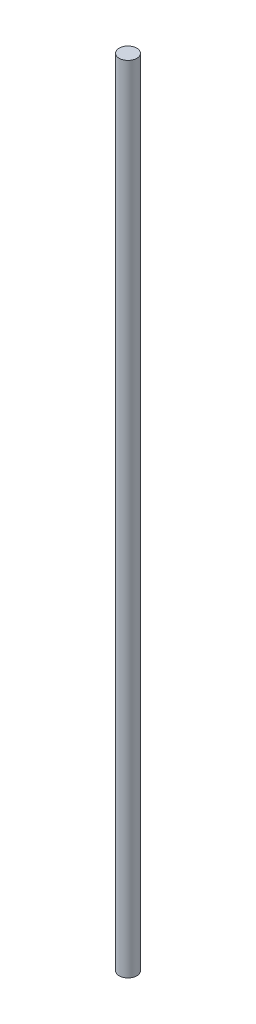
ISO-10303-21;
HEADER;
FILE_DESCRIPTION(('STEP AP214'),'2;1');
FILE_NAME('part.step','',(''),(''),'','','');
FILE_SCHEMA(('AUTOMOTIVE_DESIGN { 1 0 10303 214 1 1 1 1 }'));
ENDSEC;
DATA;
#1=APPLICATION_CONTEXT('core data for automotive mechanical design processes');
#2=APPLICATION_PROTOCOL_DEFINITION('international standard','automotive_design',2000,#1);
#3=PRODUCT_CONTEXT('',#1,'mechanical');
#4=PRODUCT('Part','Part','',(#3));
#5=PRODUCT_RELATED_PRODUCT_CATEGORY('part','',(#4));
#6=PRODUCT_DEFINITION_FORMATION('','',#4);
#7=PRODUCT_DEFINITION_CONTEXT('part definition',#1,'design');
#8=PRODUCT_DEFINITION('design','',#6,#7);
#9=PRODUCT_DEFINITION_SHAPE('','',#8);
#10=(LENGTH_UNIT() NAMED_UNIT(*) SI_UNIT(.MILLI.,.METRE.));
#11=(NAMED_UNIT(*) PLANE_ANGLE_UNIT() SI_UNIT($,.RADIAN.));
#12=(NAMED_UNIT(*) SI_UNIT($,.STERADIAN.) SOLID_ANGLE_UNIT());
#13=UNCERTAINTY_MEASURE_WITH_UNIT(LENGTH_MEASURE(1.E-05),#10,'distance_accuracy_value','');
#14=(GEOMETRIC_REPRESENTATION_CONTEXT(3) GLOBAL_UNCERTAINTY_ASSIGNED_CONTEXT((#13)) GLOBAL_UNIT_ASSIGNED_CONTEXT((#10,
#11,#12)) REPRESENTATION_CONTEXT('',''));
#15=CARTESIAN_POINT('',(0.,0.,0.));
#16=DIRECTION('',(0.,0.,1.));
#17=DIRECTION('',(1.,0.,0.));
#18=AXIS2_PLACEMENT_3D('',#15,#16,#17);
#19=CARTESIAN_POINT('',(0.,9.,0.));
#20=DIRECTION('',(0.,-1.,0.));
#21=DIRECTION('',(0.,0.,-1.));
#22=AXIS2_PLACEMENT_3D('',#19,#20,#21);
#23=CYLINDRICAL_SURFACE('',#22,0.1);
#24=CARTESIAN_POINT('',(0.,9.,0.));
#25=DIRECTION('',(0.,1.,0.));
#26=DIRECTION('',(0.,0.,1.));
#27=AXIS2_PLACEMENT_3D('',#24,#25,#26);
#28=CIRCLE('',#27,0.1);
#29=CARTESIAN_POINT('',(0.,9.,0.1));
#30=VERTEX_POINT('',#29);
#31=EDGE_CURVE('E12',#30,#30,#28,.T.);
#32=ORIENTED_EDGE('',*,*,#31,.F.);
#33=EDGE_LOOP('',(#32));
#34=FACE_BOUND('',#33,.T.);
#35=CARTESIAN_POINT('',(0.,0.,0.));
#36=DIRECTION('',(0.,1.,0.));
#37=DIRECTION('',(0.,0.,1.));
#38=AXIS2_PLACEMENT_3D('',#35,#36,#37);
#39=CIRCLE('',#38,0.1);
#40=CARTESIAN_POINT('',(0.,0.,0.1));
#41=VERTEX_POINT('',#40);
#42=EDGE_CURVE('E46',#41,#41,#39,.T.);
#43=ORIENTED_EDGE('',*,*,#42,.T.);
#44=EDGE_LOOP('',(#43));
#45=FACE_BOUND('',#44,.T.);
#46=ADVANCED_FACE('F43',(#34,#45),#23,.T.);
#47=CARTESIAN_POINT('',(0.,9.,0.));
#48=DIRECTION('',(0.,1.,0.));
#49=DIRECTION('',(0.,0.,1.));
#50=AXIS2_PLACEMENT_3D('',#47,#48,#49);
#51=PLANE('',#50);
#52=ORIENTED_EDGE('',*,*,#31,.T.);
#53=EDGE_LOOP('',(#52));
#54=FACE_BOUND('',#53,.T.);
#55=ADVANCED_FACE('F58',(#54),#51,.T.);
#56=CARTESIAN_POINT('',(0.,0.,0.));
#57=DIRECTION('',(0.,1.,0.));
#58=DIRECTION('',(0.,0.,1.));
#59=AXIS2_PLACEMENT_3D('',#56,#57,#58);
#60=PLANE('',#59);
#61=ORIENTED_EDGE('',*,*,#42,.F.);
#62=EDGE_LOOP('',(#61));
#63=FACE_BOUND('',#62,.T.);
#64=ADVANCED_FACE('F56',(#63),#60,.F.);
#65=CLOSED_SHELL('',(#46,#55,#64));
#66=MANIFOLD_SOLID_BREP('B2',#65);
#67=ADVANCED_BREP_SHAPE_REPRESENTATION('',(#18,#66),#14);
#68=SHAPE_DEFINITION_REPRESENTATION(#9,#67);
ENDSEC;
END-ISO-10303-21;
